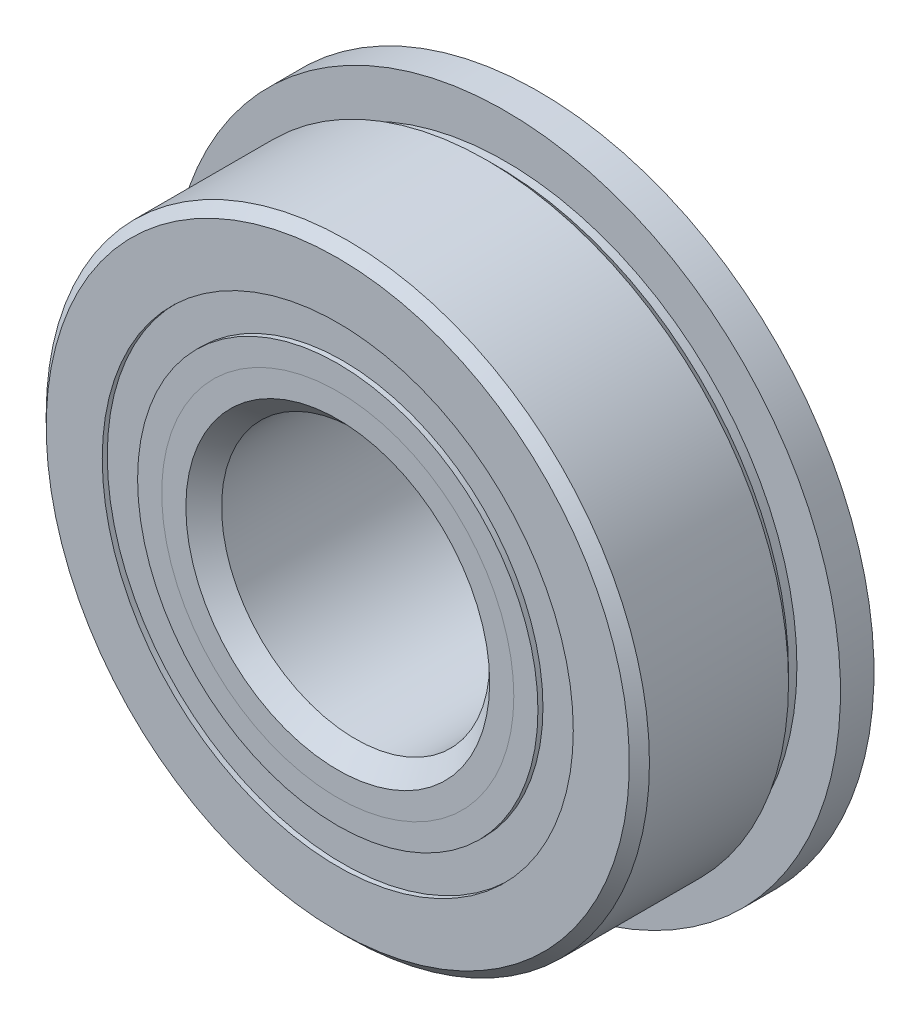
ISO-10303-21;
HEADER;
FILE_DESCRIPTION(('STEP AP214'),'2;1');
FILE_NAME('part.step','',(''),(''),'','','');
FILE_SCHEMA(('AUTOMOTIVE_DESIGN { 1 0 10303 214 1 1 1 1 }'));
ENDSEC;
DATA;
#1=APPLICATION_CONTEXT('core data for automotive mechanical design processes');
#2=APPLICATION_PROTOCOL_DEFINITION('international standard','automotive_design',2000,#1);
#3=PRODUCT_CONTEXT('',#1,'mechanical');
#4=PRODUCT('Part','Part','',(#3));
#5=PRODUCT_RELATED_PRODUCT_CATEGORY('part','',(#4));
#6=PRODUCT_DEFINITION_FORMATION('','',#4);
#7=PRODUCT_DEFINITION_CONTEXT('part definition',#1,'design');
#8=PRODUCT_DEFINITION('design','',#6,#7);
#9=PRODUCT_DEFINITION_SHAPE('','',#8);
#10=(LENGTH_UNIT() NAMED_UNIT(*) SI_UNIT(.MILLI.,.METRE.));
#11=(NAMED_UNIT(*) PLANE_ANGLE_UNIT() SI_UNIT($,.RADIAN.));
#12=(NAMED_UNIT(*) SI_UNIT($,.STERADIAN.) SOLID_ANGLE_UNIT());
#13=UNCERTAINTY_MEASURE_WITH_UNIT(LENGTH_MEASURE(1.E-05),#10,'distance_accuracy_value','');
#14=(GEOMETRIC_REPRESENTATION_CONTEXT(3) GLOBAL_UNCERTAINTY_ASSIGNED_CONTEXT((#13)) GLOBAL_UNIT_ASSIGNED_CONTEXT((#10,
#11,#12)) REPRESENTATION_CONTEXT('',''));
#15=CARTESIAN_POINT('',(0.,0.,0.));
#16=DIRECTION('',(0.,0.,1.));
#17=DIRECTION('',(1.,0.,0.));
#18=AXIS2_PLACEMENT_3D('',#15,#16,#17);
#19=CARTESIAN_POINT('',(-10.31875,1.08083231797342E-13,0.));
#20=DIRECTION('',(-1.,0.,0.));
#21=DIRECTION('',(0.,0.,1.));
#22=AXIS2_PLACEMENT_3D('',#19,#20,#21);
#23=SPHERICAL_SURFACE('',#22,2.27628073054021);
#24=CARTESIAN_POINT('',(-12.5950307305402,1.32369360461018E-13,0.));
#25=VERTEX_POINT('',#24);
#26=VERTEX_LOOP('',#25);
#27=FACE_BOUND('',#26,.T.);
#28=ADVANCED_FACE('P0_F13',(#27),#23,.T.);
#29=CLOSED_SHELL('',(#28));
#30=MANIFOLD_SOLID_BREP('P0_B1',#29);
#31=CARTESIAN_POINT('',(-8.93629963530073,-5.15937499999992,0.));
#32=DIRECTION('',(0.499999999999992,-0.866025403784443,0.));
#33=DIRECTION('',(0.866025403784443,0.499999999999992,0.));
#34=AXIS2_PLACEMENT_3D('',#31,#32,#33);
#35=SPHERICAL_SURFACE('',#34,2.27628073054021);
#36=CARTESIAN_POINT('',(-7.79815927003064,-7.13069193879275,0.));
#37=VERTEX_POINT('',#36);
#38=VERTEX_LOOP('',#37);
#39=FACE_BOUND('',#38,.T.);
#40=CARTESIAN_POINT('',(-10.0744400005708,-3.18805806120708,0.));
#41=VERTEX_POINT('',#40);
#42=VERTEX_LOOP('',#41);
#43=FACE_BOUND('',#42,.T.);
#44=ADVANCED_FACE('P1_F16',(#39,#43),#35,.T.);
#45=CLOSED_SHELL('',(#44));
#46=MANIFOLD_SOLID_BREP('P1_B1',#45);
#47=CARTESIAN_POINT('',(-5.15937499999989,8.93629963530074,0.));
#48=DIRECTION('',(-0.499999999999989,0.866025403784445,0.));
#49=DIRECTION('',(0.,0.,1.));
#50=AXIS2_PLACEMENT_3D('',#47,#48,#49);
#51=SPHERICAL_SURFACE('',#50,2.27628073054021);
#52=CARTESIAN_POINT('',(-6.29751536526997,10.9076165740936,0.));
#53=VERTEX_POINT('',#52);
#54=VERTEX_LOOP('',#53);
#55=FACE_BOUND('',#54,.T.);
#56=ADVANCED_FACE('P2_F13',(#55),#51,.T.);
#57=CLOSED_SHELL('',(#56));
#58=MANIFOLD_SOLID_BREP('P2_B1',#57);
#59=CARTESIAN_POINT('',(0.,-10.31875,0.));
#60=DIRECTION('',(0.,-1.,0.));
#61=DIRECTION('',(0.,0.,-1.));
#62=AXIS2_PLACEMENT_3D('',#59,#60,#61);
#63=SPHERICAL_SURFACE('',#62,2.27628073054021);
#64=CARTESIAN_POINT('',(0.,-12.5950307305402,0.));
#65=VERTEX_POINT('',#64);
#66=VERTEX_LOOP('',#65);
#67=FACE_BOUND('',#66,.T.);
#68=ADVANCED_FACE('P3_F13',(#67),#63,.T.);
#69=CLOSED_SHELL('',(#68));
#70=MANIFOLD_SOLID_BREP('P3_B1',#69);
#71=CARTESIAN_POINT('',(-5.15937500000007,-8.93629963530064,0.));
#72=DIRECTION('',(-0.500000000000007,-0.866025403784435,0.));
#73=DIRECTION('',(0.,0.,1.));
#74=AXIS2_PLACEMENT_3D('',#71,#72,#73);
#75=SPHERICAL_SURFACE('',#74,2.27628073054022);
#76=CARTESIAN_POINT('',(-6.2975153652702,-10.9076165740935,0.));
#77=VERTEX_POINT('',#76);
#78=VERTEX_LOOP('',#77);
#79=FACE_BOUND('',#78,.T.);
#80=ADVANCED_FACE('P4_F13',(#79),#75,.T.);
#81=CLOSED_SHELL('',(#80));
#82=MANIFOLD_SOLID_BREP('P4_B1',#81);
#83=CARTESIAN_POINT('',(10.31875,0.,0.));
#84=DIRECTION('',(1.,0.,0.));
#85=DIRECTION('',(0.,0.,-1.));
#86=AXIS2_PLACEMENT_3D('',#83,#84,#85);
#87=SPHERICAL_SURFACE('',#86,2.27628073054021);
#88=CARTESIAN_POINT('',(12.5950307305402,0.,0.));
#89=VERTEX_POINT('',#88);
#90=VERTEX_LOOP('',#89);
#91=FACE_BOUND('',#90,.T.);
#92=ADVANCED_FACE('P5_F13',(#91),#87,.T.);
#93=CLOSED_SHELL('',(#92));
#94=MANIFOLD_SOLID_BREP('P5_B1',#93);
#95=CARTESIAN_POINT('',(0.,11.1561126373626,-4.524375));
#96=DIRECTION('',(0.,0.,1.));
#97=DIRECTION('',(1.,0.,0.));
#98=AXIS2_PLACEMENT_3D('',#95,#96,#97);
#99=PLANE('',#98);
#100=CARTESIAN_POINT('',(0.,0.,-4.524375));
#101=DIRECTION('',(0.,0.,1.));
#102=DIRECTION('',(1.,0.,0.));
#103=AXIS2_PLACEMENT_3D('',#100,#101,#102);
#104=CIRCLE('',#103,11.1561126373626);
#105=CARTESIAN_POINT('',(11.1561126373626,0.,-4.524375));
#106=VERTEX_POINT('',#105);
#107=EDGE_CURVE('P6_E18',#106,#106,#104,.T.);
#108=ORIENTED_EDGE('',*,*,#107,.F.);
#109=EDGE_LOOP('',(#108));
#110=FACE_BOUND('',#109,.T.);
#111=CARTESIAN_POINT('',(0.,0.,-4.524375));
#112=DIRECTION('',(0.,0.,1.));
#113=DIRECTION('',(1.,0.,0.));
#114=AXIS2_PLACEMENT_3D('',#111,#112,#113);
#115=CIRCLE('',#114,9.48138736263736);
#116=CARTESIAN_POINT('',(9.48138736263736,0.,-4.524375));
#117=VERTEX_POINT('',#116);
#118=EDGE_CURVE('P6_E27',#117,#117,#115,.T.);
#119=ORIENTED_EDGE('',*,*,#118,.T.);
#120=EDGE_LOOP('',(#119));
#121=FACE_BOUND('',#120,.T.);
#122=ADVANCED_FACE('P6_F15',(#110,#121),#99,.F.);
#123=CARTESIAN_POINT('',(0.,0.,4.7625));
#124=DIRECTION('',(0.,0.,1.));
#125=DIRECTION('',(1.,0.,0.));
#126=AXIS2_PLACEMENT_3D('',#123,#124,#125);
#127=CYLINDRICAL_SURFACE('',#126,11.1561126373626);
#128=ORIENTED_EDGE('',*,*,#107,.T.);
#129=EDGE_LOOP('',(#128));
#130=FACE_BOUND('',#129,.T.);
#131=CARTESIAN_POINT('',(0.,0.,-2.27628073054022));
#132=DIRECTION('',(0.,0.,1.));
#133=DIRECTION('',(1.,0.,0.));
#134=AXIS2_PLACEMENT_3D('',#131,#132,#133);
#135=CIRCLE('',#134,11.1561126373626);
#136=CARTESIAN_POINT('',(11.1561126373626,0.,-2.27628073054022));
#137=VERTEX_POINT('',#136);
#138=EDGE_CURVE('P6_E22',#137,#137,#135,.F.);
#139=ORIENTED_EDGE('',*,*,#138,.T.);
#140=EDGE_LOOP('',(#139));
#141=FACE_BOUND('',#140,.T.);
#142=ADVANCED_FACE('P6_F35',(#130,#141),#127,.T.);
#143=CARTESIAN_POINT('',(0.,0.,4.7625));
#144=DIRECTION('',(0.,0.,1.));
#145=DIRECTION('',(1.,0.,0.));
#146=AXIS2_PLACEMENT_3D('',#143,#144,#145);
#147=CYLINDRICAL_SURFACE('',#146,9.48138736263736);
#148=CARTESIAN_POINT('',(0.,0.,-2.27628073054021));
#149=DIRECTION('',(0.,0.,1.));
#150=DIRECTION('',(1.,0.,0.));
#151=AXIS2_PLACEMENT_3D('',#148,#149,#150);
#152=CIRCLE('',#151,9.48138736263736);
#153=CARTESIAN_POINT('',(9.48138736263736,0.,-2.27628073054021));
#154=VERTEX_POINT('',#153);
#155=EDGE_CURVE('P6_E10',#154,#154,#152,.T.);
#156=ORIENTED_EDGE('',*,*,#155,.T.);
#157=EDGE_LOOP('',(#156));
#158=FACE_BOUND('',#157,.T.);
#159=ORIENTED_EDGE('',*,*,#118,.F.);
#160=EDGE_LOOP('',(#159));
#161=FACE_BOUND('',#160,.T.);
#162=ADVANCED_FACE('P6_F43',(#158,#161),#147,.F.);
#163=CARTESIAN_POINT('',(0.,11.1561126373626,-2.27628073054021));
#164=DIRECTION('',(0.,0.,-1.));
#165=DIRECTION('',(-1.,0.,0.));
#166=AXIS2_PLACEMENT_3D('',#163,#164,#165);
#167=PLANE('',#166);
#168=ORIENTED_EDGE('',*,*,#155,.F.);
#169=EDGE_LOOP('',(#168));
#170=FACE_BOUND('',#169,.T.);
#171=ORIENTED_EDGE('',*,*,#138,.F.);
#172=EDGE_LOOP('',(#171));
#173=FACE_BOUND('',#172,.T.);
#174=ADVANCED_FACE('P6_F44',(#170,#173),#167,.F.);
#175=CLOSED_SHELL('',(#122,#142,#162,#174));
#176=MANIFOLD_SOLID_BREP('P6_B1',#175);
#177=CARTESIAN_POINT('',(8.93629963530065,-5.15937500000004,0.));
#178=DIRECTION('',(0.866025403784437,-0.500000000000004,0.));
#179=DIRECTION('',(0.,0.,1.));
#180=AXIS2_PLACEMENT_3D('',#177,#178,#179);
#181=SPHERICAL_SURFACE('',#180,2.27628073054021);
#182=CARTESIAN_POINT('',(10.9076165740935,-6.29751536527016,0.));
#183=VERTEX_POINT('',#182);
#184=VERTEX_LOOP('',#183);
#185=FACE_BOUND('',#184,.T.);
#186=ADVANCED_FACE('P7_F13',(#185),#181,.T.);
#187=CLOSED_SHELL('',(#186));
#188=MANIFOLD_SOLID_BREP('P7_B1',#187);
#189=CARTESIAN_POINT('',(0.,10.31875,0.));
#190=DIRECTION('',(0.,1.,0.));
#191=DIRECTION('',(0.,0.,1.));
#192=AXIS2_PLACEMENT_3D('',#189,#190,#191);
#193=SPHERICAL_SURFACE('',#192,2.27628073054021);
#194=CARTESIAN_POINT('',(0.,12.5950307305402,0.));
#195=VERTEX_POINT('',#194);
#196=VERTEX_LOOP('',#195);
#197=FACE_BOUND('',#196,.T.);
#198=ADVANCED_FACE('P8_F13',(#197),#193,.T.);
#199=CLOSED_SHELL('',(#198));
#200=MANIFOLD_SOLID_BREP('P8_B1',#199);
#201=CARTESIAN_POINT('',(8.93629963530069,5.15937499999998,0.));
#202=DIRECTION('',(0.86602540378444,0.499999999999998,0.));
#203=DIRECTION('',(0.,0.,-1.));
#204=AXIS2_PLACEMENT_3D('',#201,#202,#203);
#205=SPHERICAL_SURFACE('',#204,2.27628073054021);
#206=CARTESIAN_POINT('',(10.9076165740935,6.29751536527008,0.));
#207=VERTEX_POINT('',#206);
#208=VERTEX_LOOP('',#207);
#209=FACE_BOUND('',#208,.T.);
#210=ADVANCED_FACE('P9_F13',(#209),#205,.T.);
#211=CLOSED_SHELL('',(#210));
#212=MANIFOLD_SOLID_BREP('P9_B1',#211);
#213=CARTESIAN_POINT('',(0.,0.,4.28625));
#214=DIRECTION('',(0.,0.,-1.));
#215=DIRECTION('',(0.,1.,0.));
#216=AXIS2_PLACEMENT_3D('',#213,#214,#215);
#217=CONICAL_SURFACE('',#216,14.2875,0.785398163397447);
#218=CARTESIAN_POINT('',(0.,0.,4.28625));
#219=DIRECTION('',(0.,0.,1.));
#220=DIRECTION('',(1.,0.,0.));
#221=AXIS2_PLACEMENT_3D('',#218,#219,#220);
#222=CIRCLE('',#221,14.2875);
#223=CARTESIAN_POINT('',(14.2875,0.,4.28625));
#224=VERTEX_POINT('',#223);
#225=EDGE_CURVE('P10_E31',#224,#224,#222,.F.);
#226=ORIENTED_EDGE('',*,*,#225,.F.);
#227=EDGE_LOOP('',(#226));
#228=FACE_BOUND('',#227,.T.);
#229=CARTESIAN_POINT('',(0.,0.,4.7625));
#230=DIRECTION('',(0.,0.,-1.));
#231=DIRECTION('',(0.,1.,0.));
#232=AXIS2_PLACEMENT_3D('',#229,#230,#231);
#233=CIRCLE('',#232,13.81125);
#234=CARTESIAN_POINT('',(0.,13.81125,4.7625));
#235=VERTEX_POINT('',#234);
#236=EDGE_CURVE('P10_E19',#235,#235,#233,.T.);
#237=ORIENTED_EDGE('',*,*,#236,.T.);
#238=EDGE_LOOP('',(#237));
#239=FACE_BOUND('',#238,.T.);
#240=ADVANCED_FACE('P10_F15',(#228,#239),#217,.T.);
#241=CARTESIAN_POINT('',(0.,0.,4.7625));
#242=DIRECTION('',(0.,0.,1.));
#243=DIRECTION('',(1.,0.,0.));
#244=AXIS2_PLACEMENT_3D('',#241,#242,#243);
#245=CYLINDRICAL_SURFACE('',#244,14.2875);
#246=ORIENTED_EDGE('',*,*,#225,.T.);
#247=EDGE_LOOP('',(#246));
#248=FACE_BOUND('',#247,.T.);
#249=CARTESIAN_POINT('',(0.,0.,-2.301875));
#250=DIRECTION('',(0.,0.,1.));
#251=DIRECTION('',(1.,0.,0.));
#252=AXIS2_PLACEMENT_3D('',#249,#250,#251);
#253=CIRCLE('',#252,14.2875);
#254=CARTESIAN_POINT('',(14.2875,0.,-2.301875));
#255=VERTEX_POINT('',#254);
#256=EDGE_CURVE('P10_E43',#255,#255,#253,.F.);
#257=ORIENTED_EDGE('',*,*,#256,.F.);
#258=EDGE_LOOP('',(#257));
#259=FACE_BOUND('',#258,.T.);
#260=ADVANCED_FACE('P10_F92',(#248,#259),#245,.T.);
#261=CARTESIAN_POINT('',(0.,13.81125,4.7625));
#262=DIRECTION('',(0.,0.,-1.));
#263=DIRECTION('',(-1.,0.,0.));
#264=AXIS2_PLACEMENT_3D('',#261,#262,#263);
#265=PLANE('',#264);
#266=CARTESIAN_POINT('',(0.,0.,4.7625));
#267=DIRECTION('',(0.,0.,1.));
#268=DIRECTION('',(1.,0.,0.));
#269=AXIS2_PLACEMENT_3D('',#266,#267,#268);
#270=CIRCLE('',#269,11.1561126373626);
#271=CARTESIAN_POINT('',(11.1561126373626,0.,4.7625));
#272=VERTEX_POINT('',#271);
#273=EDGE_CURVE('P10_E40',#272,#272,#270,.F.);
#274=ORIENTED_EDGE('',*,*,#273,.T.);
#275=EDGE_LOOP('',(#274));
#276=FACE_BOUND('',#275,.T.);
#277=ORIENTED_EDGE('',*,*,#236,.F.);
#278=EDGE_LOOP('',(#277));
#279=FACE_BOUND('',#278,.T.);
#280=ADVANCED_FACE('P10_F89',(#276,#279),#265,.F.);
#281=CARTESIAN_POINT('',(0.,0.,-2.301875));
#282=DIRECTION('',(0.,0.,1.));
#283=DIRECTION('',(1.,0.,0.));
#284=AXIS2_PLACEMENT_3D('',#281,#282,#283);
#285=CONICAL_SURFACE('',#284,14.2875,0.785398163397444);
#286=ORIENTED_EDGE('',*,*,#256,.T.);
#287=EDGE_LOOP('',(#286));
#288=FACE_BOUND('',#287,.T.);
#289=CARTESIAN_POINT('',(0.,0.,-2.778125));
#290=DIRECTION('',(0.,0.,1.));
#291=DIRECTION('',(1.,0.,0.));
#292=AXIS2_PLACEMENT_3D('',#289,#290,#291);
#293=CIRCLE('',#292,13.81125);
#294=CARTESIAN_POINT('',(13.81125,0.,-2.778125));
#295=VERTEX_POINT('',#294);
#296=EDGE_CURVE('P10_E42',#295,#295,#293,.F.);
#297=ORIENTED_EDGE('',*,*,#296,.F.);
#298=EDGE_LOOP('',(#297));
#299=FACE_BOUND('',#298,.T.);
#300=ADVANCED_FACE('P10_F85',(#288,#299),#285,.T.);
#301=CARTESIAN_POINT('',(0.,0.,4.7625));
#302=DIRECTION('',(0.,0.,1.));
#303=DIRECTION('',(1.,0.,0.));
#304=AXIS2_PLACEMENT_3D('',#301,#302,#303);
#305=CYLINDRICAL_SURFACE('',#304,11.1561126373626);
#306=ORIENTED_EDGE('',*,*,#273,.F.);
#307=EDGE_LOOP('',(#306));
#308=FACE_BOUND('',#307,.T.);
#309=CARTESIAN_POINT('',(0.,0.,2.11666666666667));
#310=DIRECTION('',(0.,0.,-1.));
#311=DIRECTION('',(-1.,0.,0.));
#312=AXIS2_PLACEMENT_3D('',#309,#310,#311);
#313=CIRCLE('',#312,11.1561126373626);
#314=CARTESIAN_POINT('',(-11.1561126373626,0.,2.11666666666667));
#315=VERTEX_POINT('',#314);
#316=EDGE_CURVE('P10_E39',#315,#315,#313,.T.);
#317=ORIENTED_EDGE('',*,*,#316,.T.);
#318=EDGE_LOOP('',(#317));
#319=FACE_BOUND('',#318,.T.);
#320=ADVANCED_FACE('P10_F81',(#308,#319),#305,.F.);
#321=CARTESIAN_POINT('',(0.,0.,4.7625));
#322=DIRECTION('',(0.,0.,1.));
#323=DIRECTION('',(1.,0.,0.));
#324=AXIS2_PLACEMENT_3D('',#321,#322,#323);
#325=CYLINDRICAL_SURFACE('',#324,13.81125);
#326=ORIENTED_EDGE('',*,*,#296,.T.);
#327=EDGE_LOOP('',(#326));
#328=FACE_BOUND('',#327,.T.);
#329=CARTESIAN_POINT('',(0.,0.,-3.175));
#330=DIRECTION('',(0.,0.,1.));
#331=DIRECTION('',(1.,0.,0.));
#332=AXIS2_PLACEMENT_3D('',#329,#330,#331);
#333=CIRCLE('',#332,13.81125);
#334=CARTESIAN_POINT('',(13.81125,0.,-3.175));
#335=VERTEX_POINT('',#334);
#336=EDGE_CURVE('P10_E37',#335,#335,#333,.F.);
#337=ORIENTED_EDGE('',*,*,#336,.F.);
#338=EDGE_LOOP('',(#337));
#339=FACE_BOUND('',#338,.T.);
#340=ADVANCED_FACE('P10_F77',(#328,#339),#325,.T.);
#341=CARTESIAN_POINT('',(0.,12.4836813186813,-3.175));
#342=DIRECTION('',(0.,0.,1.));
#343=DIRECTION('',(1.,0.,0.));
#344=AXIS2_PLACEMENT_3D('',#341,#342,#343);
#345=PLANE('',#344);
#346=CARTESIAN_POINT('',(0.,0.,-3.175));
#347=DIRECTION('',(0.,0.,-1.));
#348=DIRECTION('',(-1.,0.,0.));
#349=AXIS2_PLACEMENT_3D('',#346,#347,#348);
#350=CIRCLE('',#349,15.875);
#351=CARTESIAN_POINT('',(-15.875,0.,-3.175));
#352=VERTEX_POINT('',#351);
#353=EDGE_CURVE('P10_E34',#352,#352,#350,.T.);
#354=ORIENTED_EDGE('',*,*,#353,.F.);
#355=EDGE_LOOP('',(#354));
#356=FACE_BOUND('',#355,.T.);
#357=ORIENTED_EDGE('',*,*,#336,.T.);
#358=EDGE_LOOP('',(#357));
#359=FACE_BOUND('',#358,.T.);
#360=ADVANCED_FACE('P10_F74',(#356,#359),#345,.T.);
#361=CARTESIAN_POINT('',(0.,0.,0.));
#362=DIRECTION('',(0.,0.,1.));
#363=DIRECTION('',(1.,0.,0.));
#364=AXIS2_PLACEMENT_3D('',#361,#362,#363);
#365=TOROIDAL_SURFACE('',#364,10.31875,2.27628073054021);
#366=ORIENTED_EDGE('',*,*,#316,.F.);
#367=EDGE_LOOP('',(#366));
#368=FACE_BOUND('',#367,.T.);
#369=CARTESIAN_POINT('',(0.,0.,-2.11666666666667));
#370=DIRECTION('',(0.,0.,1.));
#371=DIRECTION('',(1.,0.,0.));
#372=AXIS2_PLACEMENT_3D('',#369,#370,#371);
#373=CIRCLE('',#372,11.1561126373626);
#374=CARTESIAN_POINT('',(11.1561126373626,0.,-2.11666666666667));
#375=VERTEX_POINT('',#374);
#376=EDGE_CURVE('P10_E28',#375,#375,#373,.F.);
#377=ORIENTED_EDGE('',*,*,#376,.T.);
#378=EDGE_LOOP('',(#377));
#379=FACE_BOUND('',#378,.T.);
#380=ADVANCED_FACE('P10_F17',(#368,#379),#365,.F.);
#381=CARTESIAN_POINT('',(0.,0.,-6.35));
#382=DIRECTION('',(0.,0.,-1.));
#383=DIRECTION('',(-1.,0.,0.));
#384=AXIS2_PLACEMENT_3D('',#381,#382,#383);
#385=CYLINDRICAL_SURFACE('',#384,15.875);
#386=ORIENTED_EDGE('',*,*,#353,.T.);
#387=EDGE_LOOP('',(#386));
#388=FACE_BOUND('',#387,.T.);
#389=CARTESIAN_POINT('',(0.,0.,-4.7625));
#390=DIRECTION('',(0.,0.,-1.));
#391=DIRECTION('',(-1.,0.,0.));
#392=AXIS2_PLACEMENT_3D('',#389,#390,#391);
#393=CIRCLE('',#392,15.875);
#394=CARTESIAN_POINT('',(-15.875,0.,-4.7625));
#395=VERTEX_POINT('',#394);
#396=EDGE_CURVE('P10_E23',#395,#395,#393,.F.);
#397=ORIENTED_EDGE('',*,*,#396,.T.);
#398=EDGE_LOOP('',(#397));
#399=FACE_BOUND('',#398,.T.);
#400=ADVANCED_FACE('P10_F62',(#388,#399),#385,.T.);
#401=CARTESIAN_POINT('',(0.,0.,4.7625));
#402=DIRECTION('',(0.,0.,1.));
#403=DIRECTION('',(1.,0.,0.));
#404=AXIS2_PLACEMENT_3D('',#401,#402,#403);
#405=CYLINDRICAL_SURFACE('',#404,11.1561126373626);
#406=ORIENTED_EDGE('',*,*,#376,.F.);
#407=EDGE_LOOP('',(#406));
#408=FACE_BOUND('',#407,.T.);
#409=CARTESIAN_POINT('',(0.,0.,-4.7625));
#410=DIRECTION('',(0.,0.,1.));
#411=DIRECTION('',(1.,0.,0.));
#412=AXIS2_PLACEMENT_3D('',#409,#410,#411);
#413=CIRCLE('',#412,11.1561126373626);
#414=CARTESIAN_POINT('',(11.1561126373626,0.,-4.7625));
#415=VERTEX_POINT('',#414);
#416=EDGE_CURVE('P10_E10',#415,#415,#413,.F.);
#417=ORIENTED_EDGE('',*,*,#416,.T.);
#418=EDGE_LOOP('',(#417));
#419=FACE_BOUND('',#418,.T.);
#420=ADVANCED_FACE('P10_F59',(#408,#419),#405,.F.);
#421=CARTESIAN_POINT('',(0.,13.81125,-4.7625));
#422=DIRECTION('',(0.,0.,1.));
#423=DIRECTION('',(1.,0.,0.));
#424=AXIS2_PLACEMENT_3D('',#421,#422,#423);
#425=PLANE('',#424);
#426=ORIENTED_EDGE('',*,*,#416,.F.);
#427=EDGE_LOOP('',(#426));
#428=FACE_BOUND('',#427,.T.);
#429=ORIENTED_EDGE('',*,*,#396,.F.);
#430=EDGE_LOOP('',(#429));
#431=FACE_BOUND('',#430,.T.);
#432=ADVANCED_FACE('P10_F61',(#428,#431),#425,.F.);
#433=CLOSED_SHELL('',(#240,#260,#280,#300,#320,#340,#360,#380,#400,#420,#432));
#434=MANIFOLD_SOLID_BREP('P10_B1',#433);
#435=CARTESIAN_POINT('',(-8.93629963530062,5.1593750000001,0.));
#436=DIRECTION('',(-0.866025403784433,0.50000000000001,0.));
#437=DIRECTION('',(0.,0.,1.));
#438=AXIS2_PLACEMENT_3D('',#435,#436,#437);
#439=SPHERICAL_SURFACE('',#438,2.27628073054021);
#440=CARTESIAN_POINT('',(-10.9076165740934,6.29751536527023,0.));
#441=VERTEX_POINT('',#440);
#442=VERTEX_LOOP('',#441);
#443=FACE_BOUND('',#442,.T.);
#444=ADVANCED_FACE('P11_F13',(#443),#439,.T.);
#445=CLOSED_SHELL('',(#444));
#446=MANIFOLD_SOLID_BREP('P11_B1',#445);
#447=CARTESIAN_POINT('',(5.15937500000001,8.93629963530067,0.));
#448=DIRECTION('',(0.500000000000001,0.866025403784438,0.));
#449=DIRECTION('',(0.,0.,-1.));
#450=AXIS2_PLACEMENT_3D('',#447,#448,#449);
#451=SPHERICAL_SURFACE('',#450,2.27628073054021);
#452=CARTESIAN_POINT('',(6.29751536527012,10.9076165740935,0.));
#453=VERTEX_POINT('',#452);
#454=VERTEX_LOOP('',#453);
#455=FACE_BOUND('',#454,.T.);
#456=ADVANCED_FACE('P12_F13',(#455),#451,.T.);
#457=CLOSED_SHELL('',(#456));
#458=MANIFOLD_SOLID_BREP('P12_B1',#457);
#459=CARTESIAN_POINT('',(0.,7.19623463472989,0.));
#460=DIRECTION('',(0.,0.,-1.));
#461=DIRECTION('',(-1.,0.,0.));
#462=AXIS2_PLACEMENT_3D('',#459,#460,#461);
#463=PLANE('',#462);
#464=CARTESIAN_POINT('',(0.,0.,0.));
#465=DIRECTION('',(0.,0.,1.));
#466=DIRECTION('',(1.,0.,0.));
#467=AXIS2_PLACEMENT_3D('',#464,#465,#466);
#468=CIRCLE('',#467,7.19623463472989);
#469=CARTESIAN_POINT('',(7.19623463472989,0.,0.));
#470=VERTEX_POINT('',#469);
#471=EDGE_CURVE('P13_E19',#470,#470,#468,.T.);
#472=ORIENTED_EDGE('',*,*,#471,.F.);
#473=EDGE_LOOP('',(#472));
#474=FACE_BOUND('',#473,.T.);
#475=CARTESIAN_POINT('',(0.,0.,0.));
#476=DIRECTION('',(0.,0.,1.));
#477=DIRECTION('',(1.,0.,0.));
#478=AXIS2_PLACEMENT_3D('',#475,#476,#477);
#479=CIRCLE('',#478,8.04246926945979);
#480=CARTESIAN_POINT('',(8.04246926945979,0.,0.));
#481=VERTEX_POINT('',#480);
#482=EDGE_CURVE('P13_E38',#481,#481,#479,.T.);
#483=ORIENTED_EDGE('',*,*,#482,.T.);
#484=EDGE_LOOP('',(#483));
#485=FACE_BOUND('',#484,.T.);
#486=ADVANCED_FACE('P13_F15',(#474,#485),#463,.F.);
#487=CARTESIAN_POINT('',(0.,0.,4.7625));
#488=DIRECTION('',(0.,0.,1.));
#489=DIRECTION('',(1.,0.,0.));
#490=AXIS2_PLACEMENT_3D('',#487,#488,#489);
#491=CYLINDRICAL_SURFACE('',#490,7.19623463472989);
#492=ORIENTED_EDGE('',*,*,#471,.T.);
#493=EDGE_LOOP('',(#492));
#494=FACE_BOUND('',#493,.T.);
#495=CARTESIAN_POINT('',(0.,0.,3.61992363604627));
#496=DIRECTION('',(0.,0.,1.));
#497=DIRECTION('',(1.,0.,0.));
#498=AXIS2_PLACEMENT_3D('',#495,#496,#497);
#499=CIRCLE('',#498,7.19623463472989);
#500=CARTESIAN_POINT('',(7.19623463472989,0.,3.61992363604627));
#501=VERTEX_POINT('',#500);
#502=EDGE_CURVE('P13_E35',#501,#501,#499,.T.);
#503=ORIENTED_EDGE('',*,*,#502,.F.);
#504=EDGE_LOOP('',(#503));
#505=FACE_BOUND('',#504,.T.);
#506=ADVANCED_FACE('P13_F54',(#494,#505),#491,.T.);
#507=CARTESIAN_POINT('',(0.,0.,0.));
#508=DIRECTION('',(0.,0.,1.));
#509=DIRECTION('',(1.,0.,0.));
#510=AXIS2_PLACEMENT_3D('',#507,#508,#509);
#511=TOROIDAL_SURFACE('',#510,10.31875,2.27628073054022);
#512=ORIENTED_EDGE('',*,*,#482,.F.);
#513=EDGE_LOOP('',(#512));
#514=FACE_BOUND('',#513,.T.);
#515=CARTESIAN_POINT('',(0.,0.,-2.11666666666667));
#516=DIRECTION('',(0.,0.,1.));
#517=DIRECTION('',(1.,0.,0.));
#518=AXIS2_PLACEMENT_3D('',#515,#516,#517);
#519=CIRCLE('',#518,9.48138736263736);
#520=CARTESIAN_POINT('',(9.48138736263736,0.,-2.11666666666667));
#521=VERTEX_POINT('',#520);
#522=EDGE_CURVE('P13_E31',#521,#521,#519,.F.);
#523=ORIENTED_EDGE('',*,*,#522,.F.);
#524=EDGE_LOOP('',(#523));
#525=FACE_BOUND('',#524,.T.);
#526=ADVANCED_FACE('P13_F17',(#514,#525),#511,.F.);
#527=CARTESIAN_POINT('',(0.,0.,4.7625));
#528=DIRECTION('',(0.,0.,1.));
#529=DIRECTION('',(1.,0.,0.));
#530=AXIS2_PLACEMENT_3D('',#527,#528,#529);
#531=CONICAL_SURFACE('',#530,8.33881099868363,0.78539816339745);
#532=ORIENTED_EDGE('',*,*,#502,.T.);
#533=EDGE_LOOP('',(#532));
#534=FACE_BOUND('',#533,.T.);
#535=CARTESIAN_POINT('',(0.,0.,4.7625));
#536=DIRECTION('',(0.,0.,1.));
#537=DIRECTION('',(1.,0.,0.));
#538=AXIS2_PLACEMENT_3D('',#535,#536,#537);
#539=CIRCLE('',#538,8.33881099868363);
#540=CARTESIAN_POINT('',(8.33881099868363,0.,4.7625));
#541=VERTEX_POINT('',#540);
#542=EDGE_CURVE('P13_E34',#541,#541,#539,.F.);
#543=ORIENTED_EDGE('',*,*,#542,.T.);
#544=EDGE_LOOP('',(#543));
#545=FACE_BOUND('',#544,.T.);
#546=ADVANCED_FACE('P13_F90',(#534,#545),#531,.T.);
#547=CARTESIAN_POINT('',(0.,0.,4.7625));
#548=DIRECTION('',(0.,0.,1.));
#549=DIRECTION('',(1.,0.,0.));
#550=AXIS2_PLACEMENT_3D('',#547,#548,#549);
#551=CYLINDRICAL_SURFACE('',#550,9.48138736263736);
#552=ORIENTED_EDGE('',*,*,#522,.T.);
#553=EDGE_LOOP('',(#552));
#554=FACE_BOUND('',#553,.T.);
#555=CARTESIAN_POINT('',(0.,0.,-6.35));
#556=DIRECTION('',(0.,0.,1.));
#557=DIRECTION('',(1.,0.,0.));
#558=AXIS2_PLACEMENT_3D('',#555,#556,#557);
#559=CIRCLE('',#558,9.48138736263736);
#560=CARTESIAN_POINT('',(9.48138736263736,0.,-6.35));
#561=VERTEX_POINT('',#560);
#562=EDGE_CURVE('P13_E44',#561,#561,#559,.T.);
#563=ORIENTED_EDGE('',*,*,#562,.T.);
#564=EDGE_LOOP('',(#563));
#565=FACE_BOUND('',#564,.T.);
#566=ADVANCED_FACE('P13_F86',(#554,#565),#551,.T.);
#567=CARTESIAN_POINT('',(0.,8.33881099868363,4.7625));
#568=DIRECTION('',(0.,0.,-1.));
#569=DIRECTION('',(-1.,0.,0.));
#570=AXIS2_PLACEMENT_3D('',#567,#568,#569);
#571=PLANE('',#570);
#572=CARTESIAN_POINT('',(0.,0.,4.7625));
#573=DIRECTION('',(0.,0.,1.));
#574=DIRECTION('',(1.,0.,0.));
#575=AXIS2_PLACEMENT_3D('',#572,#573,#574);
#576=CIRCLE('',#575,7.19623463472989);
#577=CARTESIAN_POINT('',(7.19623463472989,0.,4.7625));
#578=VERTEX_POINT('',#577);
#579=EDGE_CURVE('P13_E41',#578,#578,#576,.F.);
#580=ORIENTED_EDGE('',*,*,#579,.T.);
#581=EDGE_LOOP('',(#580));
#582=FACE_BOUND('',#581,.T.);
#583=ORIENTED_EDGE('',*,*,#542,.F.);
#584=EDGE_LOOP('',(#583));
#585=FACE_BOUND('',#584,.T.);
#586=ADVANCED_FACE('P13_F82',(#582,#585),#571,.F.);
#587=CARTESIAN_POINT('',(0.,6.82625,-6.35));
#588=DIRECTION('',(0.,0.,1.));
#589=DIRECTION('',(1.,0.,0.));
#590=AXIS2_PLACEMENT_3D('',#587,#588,#589);
#591=PLANE('',#590);
#592=ORIENTED_EDGE('',*,*,#562,.F.);
#593=EDGE_LOOP('',(#592));
#594=FACE_BOUND('',#593,.T.);
#595=CARTESIAN_POINT('',(0.,0.,-6.34999999994079));
#596=DIRECTION('',(0.,0.,-1.));
#597=DIRECTION('',(-1.,0.,0.));
#598=AXIS2_PLACEMENT_3D('',#595,#596,#597);
#599=CIRCLE('',#598,6.82625000001735);
#600=CARTESIAN_POINT('',(-6.82625000001735,0.,-6.34999999994079));
#601=VERTEX_POINT('',#600);
#602=EDGE_CURVE('P13_E28',#601,#601,#599,.F.);
#603=ORIENTED_EDGE('',*,*,#602,.T.);
#604=EDGE_LOOP('',(#603));
#605=FACE_BOUND('',#604,.T.);
#606=ADVANCED_FACE('P13_F78',(#594,#605),#591,.F.);
#607=CARTESIAN_POINT('',(0.,0.,4.7625));
#608=DIRECTION('',(0.,0.,1.));
#609=DIRECTION('',(1.,0.,0.));
#610=AXIS2_PLACEMENT_3D('',#607,#608,#609);
#611=CONICAL_SURFACE('',#610,7.19623463472989,0.785398163397448);
#612=ORIENTED_EDGE('',*,*,#579,.F.);
#613=EDGE_LOOP('',(#612));
#614=FACE_BOUND('',#613,.T.);
#615=CARTESIAN_POINT('',(0.,0.,3.91626536527011));
#616=DIRECTION('',(0.,0.,1.));
#617=DIRECTION('',(1.,0.,0.));
#618=AXIS2_PLACEMENT_3D('',#615,#616,#617);
#619=CIRCLE('',#618,6.35);
#620=CARTESIAN_POINT('',(6.35,0.,3.91626536527011));
#621=VERTEX_POINT('',#620);
#622=EDGE_CURVE('P13_E23',#621,#621,#619,.F.);
#623=ORIENTED_EDGE('',*,*,#622,.T.);
#624=EDGE_LOOP('',(#623));
#625=FACE_BOUND('',#624,.T.);
#626=ADVANCED_FACE('P13_F71',(#614,#625),#611,.F.);
#627=CARTESIAN_POINT('',(0.,0.,-6.34999999994079));
#628=DIRECTION('',(0.,0.,-1.));
#629=DIRECTION('',(-1.,0.,0.));
#630=AXIS2_PLACEMENT_3D('',#627,#628,#629);
#631=CONICAL_SURFACE('',#630,6.82625000001735,0.785398163278092);
#632=CARTESIAN_POINT('',(0.,0.,-5.87375));
#633=DIRECTION('',(0.,0.,1.));
#634=DIRECTION('',(1.,0.,0.));
#635=AXIS2_PLACEMENT_3D('',#632,#633,#634);
#636=CIRCLE('',#635,6.35);
#637=CARTESIAN_POINT('',(6.35,0.,-5.87375));
#638=VERTEX_POINT('',#637);
#639=EDGE_CURVE('P13_E10',#638,#638,#636,.T.);
#640=ORIENTED_EDGE('',*,*,#639,.T.);
#641=EDGE_LOOP('',(#640));
#642=FACE_BOUND('',#641,.T.);
#643=ORIENTED_EDGE('',*,*,#602,.F.);
#644=EDGE_LOOP('',(#643));
#645=FACE_BOUND('',#644,.T.);
#646=ADVANCED_FACE('P13_F65',(#642,#645),#631,.F.);
#647=CARTESIAN_POINT('',(0.,0.,4.7625));
#648=DIRECTION('',(0.,0.,1.));
#649=DIRECTION('',(1.,0.,0.));
#650=AXIS2_PLACEMENT_3D('',#647,#648,#649);
#651=CYLINDRICAL_SURFACE('',#650,6.35);
#652=ORIENTED_EDGE('',*,*,#622,.F.);
#653=EDGE_LOOP('',(#652));
#654=FACE_BOUND('',#653,.T.);
#655=ORIENTED_EDGE('',*,*,#639,.F.);
#656=EDGE_LOOP('',(#655));
#657=FACE_BOUND('',#656,.T.);
#658=ADVANCED_FACE('P13_F63',(#654,#657),#651,.F.);
#659=CLOSED_SHELL('',(#486,#506,#526,#546,#566,#586,#606,#626,#646,#658));
#660=MANIFOLD_SOLID_BREP('P13_B1',#659);
#661=CARTESIAN_POINT('',(5.15937499999995,-8.93629963530071,0.));
#662=DIRECTION('',(0.499999999999995,-0.866025403784442,0.));
#663=DIRECTION('',(0.,0.,1.));
#664=AXIS2_PLACEMENT_3D('',#661,#662,#663);
#665=SPHERICAL_SURFACE('',#664,2.27628073054022);
#666=CARTESIAN_POINT('',(6.29751536527005,-10.9076165740935,0.));
#667=VERTEX_POINT('',#666);
#668=VERTEX_LOOP('',#667);
#669=FACE_BOUND('',#668,.T.);
#670=ADVANCED_FACE('P14_F13',(#669),#665,.T.);
#671=CLOSED_SHELL('',(#670));
#672=MANIFOLD_SOLID_BREP('P14_B1',#671);
#673=CARTESIAN_POINT('',(0.,11.1561126373626,4.524375));
#674=DIRECTION('',(0.,0.,-1.));
#675=DIRECTION('',(-1.,0.,0.));
#676=AXIS2_PLACEMENT_3D('',#673,#674,#675);
#677=PLANE('',#676);
#678=CARTESIAN_POINT('',(0.,0.,4.524375));
#679=DIRECTION('',(0.,0.,1.));
#680=DIRECTION('',(1.,0.,0.));
#681=AXIS2_PLACEMENT_3D('',#678,#679,#680);
#682=CIRCLE('',#681,9.48138736263736);
#683=CARTESIAN_POINT('',(9.48138736263736,0.,4.524375));
#684=VERTEX_POINT('',#683);
#685=EDGE_CURVE('P15_E18',#684,#684,#682,.F.);
#686=ORIENTED_EDGE('',*,*,#685,.T.);
#687=EDGE_LOOP('',(#686));
#688=FACE_BOUND('',#687,.T.);
#689=CARTESIAN_POINT('',(0.,0.,4.524375));
#690=DIRECTION('',(0.,0.,1.));
#691=DIRECTION('',(1.,0.,0.));
#692=AXIS2_PLACEMENT_3D('',#689,#690,#691);
#693=CIRCLE('',#692,11.1561126373626);
#694=CARTESIAN_POINT('',(11.1561126373626,0.,4.524375));
#695=VERTEX_POINT('',#694);
#696=EDGE_CURVE('P15_E27',#695,#695,#693,.F.);
#697=ORIENTED_EDGE('',*,*,#696,.F.);
#698=EDGE_LOOP('',(#697));
#699=FACE_BOUND('',#698,.T.);
#700=ADVANCED_FACE('P15_F15',(#688,#699),#677,.F.);
#701=CARTESIAN_POINT('',(0.,0.,4.7625));
#702=DIRECTION('',(0.,0.,1.));
#703=DIRECTION('',(1.,0.,0.));
#704=AXIS2_PLACEMENT_3D('',#701,#702,#703);
#705=CYLINDRICAL_SURFACE('',#704,9.48138736263736);
#706=ORIENTED_EDGE('',*,*,#685,.F.);
#707=EDGE_LOOP('',(#706));
#708=FACE_BOUND('',#707,.T.);
#709=CARTESIAN_POINT('',(0.,0.,2.27628073054021));
#710=DIRECTION('',(0.,0.,1.));
#711=DIRECTION('',(1.,0.,0.));
#712=AXIS2_PLACEMENT_3D('',#709,#710,#711);
#713=CIRCLE('',#712,9.48138736263736);
#714=CARTESIAN_POINT('',(9.48138736263736,0.,2.27628073054021));
#715=VERTEX_POINT('',#714);
#716=EDGE_CURVE('P15_E22',#715,#715,#713,.F.);
#717=ORIENTED_EDGE('',*,*,#716,.T.);
#718=EDGE_LOOP('',(#717));
#719=FACE_BOUND('',#718,.T.);
#720=ADVANCED_FACE('P15_F37',(#708,#719),#705,.F.);
#721=CARTESIAN_POINT('',(0.,0.,4.7625));
#722=DIRECTION('',(0.,0.,1.));
#723=DIRECTION('',(1.,0.,0.));
#724=AXIS2_PLACEMENT_3D('',#721,#722,#723);
#725=CYLINDRICAL_SURFACE('',#724,11.1561126373626);
#726=ORIENTED_EDGE('',*,*,#696,.T.);
#727=EDGE_LOOP('',(#726));
#728=FACE_BOUND('',#727,.T.);
#729=CARTESIAN_POINT('',(0.,0.,2.27628073054021));
#730=DIRECTION('',(0.,0.,1.));
#731=DIRECTION('',(1.,0.,0.));
#732=AXIS2_PLACEMENT_3D('',#729,#730,#731);
#733=CIRCLE('',#732,11.1561126373626);
#734=CARTESIAN_POINT('',(11.1561126373626,0.,2.27628073054021));
#735=VERTEX_POINT('',#734);
#736=EDGE_CURVE('P15_E10',#735,#735,#733,.T.);
#737=ORIENTED_EDGE('',*,*,#736,.T.);
#738=EDGE_LOOP('',(#737));
#739=FACE_BOUND('',#738,.T.);
#740=ADVANCED_FACE('P15_F40',(#728,#739),#725,.T.);
#741=CARTESIAN_POINT('',(0.,11.1561126373626,2.27628073054021));
#742=DIRECTION('',(0.,0.,1.));
#743=DIRECTION('',(1.,0.,0.));
#744=AXIS2_PLACEMENT_3D('',#741,#742,#743);
#745=PLANE('',#744);
#746=ORIENTED_EDGE('',*,*,#736,.F.);
#747=EDGE_LOOP('',(#746));
#748=FACE_BOUND('',#747,.T.);
#749=ORIENTED_EDGE('',*,*,#716,.F.);
#750=EDGE_LOOP('',(#749));
#751=FACE_BOUND('',#750,.T.);
#752=ADVANCED_FACE('P15_F43',(#748,#751),#745,.F.);
#753=CLOSED_SHELL('',(#700,#720,#740,#752));
#754=MANIFOLD_SOLID_BREP('P15_B1',#753);
#755=CARTESIAN_POINT('',(0.,0.,4.7625));
#756=DIRECTION('',(0.,0.,1.));
#757=DIRECTION('',(1.,0.,0.));
#758=AXIS2_PLACEMENT_3D('',#755,#756,#757);
#759=CYLINDRICAL_SURFACE('',#758,9.48138736263736);
#760=CARTESIAN_POINT('',(0.,0.,4.7625));
#761=DIRECTION('',(0.,0.,1.));
#762=DIRECTION('',(1.,0.,0.));
#763=AXIS2_PLACEMENT_3D('',#760,#761,#762);
#764=CIRCLE('',#763,9.48138736263736);
#765=CARTESIAN_POINT('',(9.48138736263736,0.,4.7625));
#766=VERTEX_POINT('',#765);
#767=EDGE_CURVE('P16_E19',#766,#766,#764,.F.);
#768=ORIENTED_EDGE('',*,*,#767,.T.);
#769=EDGE_LOOP('',(#768));
#770=FACE_BOUND('',#769,.T.);
#771=CARTESIAN_POINT('',(0.,0.,2.11666666666666));
#772=DIRECTION('',(0.,0.,1.));
#773=DIRECTION('',(1.,0.,0.));
#774=AXIS2_PLACEMENT_3D('',#771,#772,#773);
#775=CIRCLE('',#774,9.48138736263736);
#776=CARTESIAN_POINT('',(9.48138736263736,0.,2.11666666666666));
#777=VERTEX_POINT('',#776);
#778=EDGE_CURVE('P16_E32',#777,#777,#775,.T.);
#779=ORIENTED_EDGE('',*,*,#778,.T.);
#780=EDGE_LOOP('',(#779));
#781=FACE_BOUND('',#780,.T.);
#782=ADVANCED_FACE('P16_F15',(#770,#781),#759,.T.);
#783=CARTESIAN_POINT('',(0.,9.48138736263736,4.7625));
#784=DIRECTION('',(0.,0.,-1.));
#785=DIRECTION('',(-1.,0.,0.));
#786=AXIS2_PLACEMENT_3D('',#783,#784,#785);
#787=PLANE('',#786);
#788=CARTESIAN_POINT('',(0.,0.,4.7625));
#789=DIRECTION('',(0.,0.,1.));
#790=DIRECTION('',(1.,0.,0.));
#791=AXIS2_PLACEMENT_3D('',#788,#789,#790);
#792=CIRCLE('',#791,8.33881099868363);
#793=CARTESIAN_POINT('',(8.33881099868363,0.,4.7625));
#794=VERTEX_POINT('',#793);
#795=EDGE_CURVE('P16_E34',#794,#794,#792,.F.);
#796=ORIENTED_EDGE('',*,*,#795,.T.);
#797=EDGE_LOOP('',(#796));
#798=FACE_BOUND('',#797,.T.);
#799=ORIENTED_EDGE('',*,*,#767,.F.);
#800=EDGE_LOOP('',(#799));
#801=FACE_BOUND('',#800,.T.);
#802=ADVANCED_FACE('P16_F45',(#798,#801),#787,.F.);
#803=CARTESIAN_POINT('',(0.,0.,0.));
#804=DIRECTION('',(0.,0.,1.));
#805=DIRECTION('',(0.,-1.,0.));
#806=AXIS2_PLACEMENT_3D('',#803,#804,#805);
#807=TOROIDAL_SURFACE('',#806,10.31875,2.27628073054021);
#808=ORIENTED_EDGE('',*,*,#778,.F.);
#809=EDGE_LOOP('',(#808));
#810=FACE_BOUND('',#809,.T.);
#811=CARTESIAN_POINT('',(0.,0.,0.));
#812=DIRECTION('',(0.,0.,1.));
#813=DIRECTION('',(0.,-1.,0.));
#814=AXIS2_PLACEMENT_3D('',#811,#812,#813);
#815=CIRCLE('',#814,8.04246926945978);
#816=CARTESIAN_POINT('',(0.,-8.04246926945978,0.));
#817=VERTEX_POINT('',#816);
#818=EDGE_CURVE('P16_E28',#817,#817,#815,.T.);
#819=ORIENTED_EDGE('',*,*,#818,.T.);
#820=EDGE_LOOP('',(#819));
#821=FACE_BOUND('',#820,.T.);
#822=ADVANCED_FACE('P16_F17',(#810,#821),#807,.F.);
#823=CARTESIAN_POINT('',(0.,0.,4.7625));
#824=DIRECTION('',(0.,0.,1.));
#825=DIRECTION('',(1.,0.,0.));
#826=AXIS2_PLACEMENT_3D('',#823,#824,#825);
#827=CONICAL_SURFACE('',#826,8.33881099868363,0.78539816339745);
#828=ORIENTED_EDGE('',*,*,#795,.F.);
#829=EDGE_LOOP('',(#828));
#830=FACE_BOUND('',#829,.T.);
#831=CARTESIAN_POINT('',(0.,0.,3.61992363604627));
#832=DIRECTION('',(0.,0.,1.));
#833=DIRECTION('',(1.,0.,0.));
#834=AXIS2_PLACEMENT_3D('',#831,#832,#833);
#835=CIRCLE('',#834,7.19623463472989);
#836=CARTESIAN_POINT('',(7.19623463472989,0.,3.61992363604627));
#837=VERTEX_POINT('',#836);
#838=EDGE_CURVE('P16_E23',#837,#837,#835,.F.);
#839=ORIENTED_EDGE('',*,*,#838,.T.);
#840=EDGE_LOOP('',(#839));
#841=FACE_BOUND('',#840,.T.);
#842=ADVANCED_FACE('P16_F53',(#830,#841),#827,.F.);
#843=CARTESIAN_POINT('',(0.,7.19623463472989,0.));
#844=DIRECTION('',(0.,0.,1.));
#845=DIRECTION('',(1.,0.,0.));
#846=AXIS2_PLACEMENT_3D('',#843,#844,#845);
#847=PLANE('',#846);
#848=ORIENTED_EDGE('',*,*,#818,.F.);
#849=EDGE_LOOP('',(#848));
#850=FACE_BOUND('',#849,.T.);
#851=CARTESIAN_POINT('',(0.,0.,0.));
#852=DIRECTION('',(0.,0.,1.));
#853=DIRECTION('',(1.,0.,0.));
#854=AXIS2_PLACEMENT_3D('',#851,#852,#853);
#855=CIRCLE('',#854,7.19623463472989);
#856=CARTESIAN_POINT('',(7.19623463472989,0.,0.));
#857=VERTEX_POINT('',#856);
#858=EDGE_CURVE('P16_E10',#857,#857,#855,.T.);
#859=ORIENTED_EDGE('',*,*,#858,.T.);
#860=EDGE_LOOP('',(#859));
#861=FACE_BOUND('',#860,.T.);
#862=ADVANCED_FACE('P16_F58',(#850,#861),#847,.F.);
#863=CARTESIAN_POINT('',(0.,0.,4.7625));
#864=DIRECTION('',(0.,0.,1.));
#865=DIRECTION('',(1.,0.,0.));
#866=AXIS2_PLACEMENT_3D('',#863,#864,#865);
#867=CYLINDRICAL_SURFACE('',#866,7.19623463472989);
#868=ORIENTED_EDGE('',*,*,#838,.F.);
#869=EDGE_LOOP('',(#868));
#870=FACE_BOUND('',#869,.T.);
#871=ORIENTED_EDGE('',*,*,#858,.F.);
#872=EDGE_LOOP('',(#871));
#873=FACE_BOUND('',#872,.T.);
#874=ADVANCED_FACE('P16_F56',(#870,#873),#867,.F.);
#875=CLOSED_SHELL('',(#782,#802,#822,#842,#862,#874));
#876=MANIFOLD_SOLID_BREP('P16_B1',#875);
#877=ADVANCED_BREP_SHAPE_REPRESENTATION('',(#18,#30,#46,#58,#70,#82,#94,#176,#188,#200,#212,
#434,#446,#458,#660,#672,#754,#876),#14);
#878=SHAPE_DEFINITION_REPRESENTATION(#9,#877);
ENDSEC;
END-ISO-10303-21;
